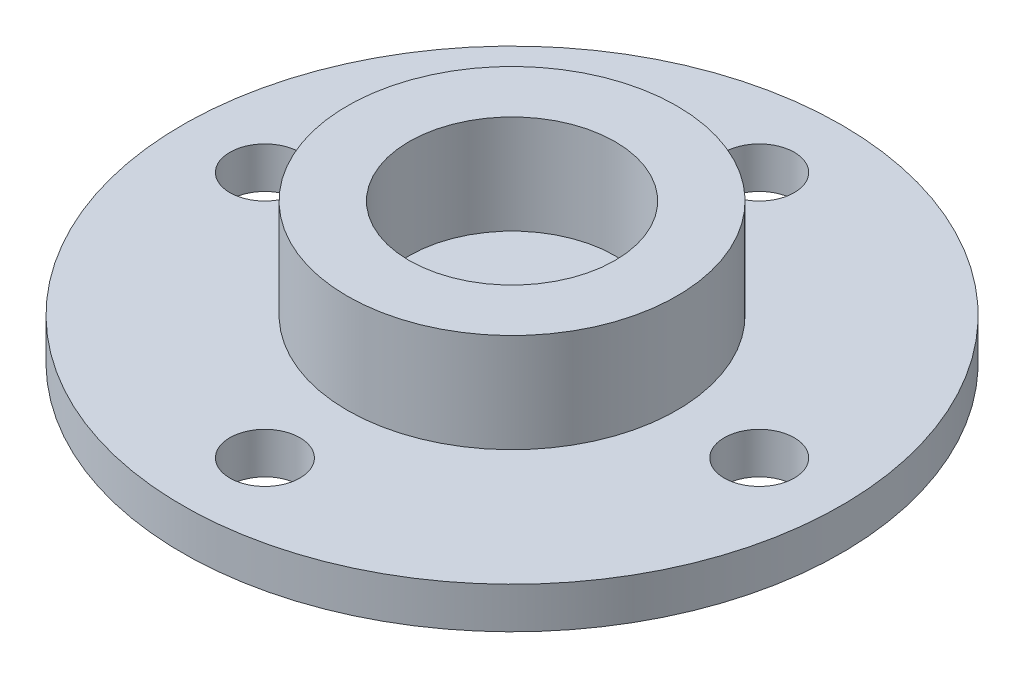
ISO-10303-21;
HEADER;
FILE_DESCRIPTION(('STEP AP214'),'2;1');
FILE_NAME('part.step','',(''),(''),'','','');
FILE_SCHEMA(('AUTOMOTIVE_DESIGN { 1 0 10303 214 1 1 1 1 }'));
ENDSEC;
DATA;
#1=APPLICATION_CONTEXT('core data for automotive mechanical design processes');
#2=APPLICATION_PROTOCOL_DEFINITION('international standard','automotive_design',2000,#1);
#3=PRODUCT_CONTEXT('',#1,'mechanical');
#4=PRODUCT('Part','Part','',(#3));
#5=PRODUCT_RELATED_PRODUCT_CATEGORY('part','',(#4));
#6=PRODUCT_DEFINITION_FORMATION('','',#4);
#7=PRODUCT_DEFINITION_CONTEXT('part definition',#1,'design');
#8=PRODUCT_DEFINITION('design','',#6,#7);
#9=PRODUCT_DEFINITION_SHAPE('','',#8);
#10=(LENGTH_UNIT() NAMED_UNIT(*) SI_UNIT(.MILLI.,.METRE.));
#11=(NAMED_UNIT(*) PLANE_ANGLE_UNIT() SI_UNIT($,.RADIAN.));
#12=(NAMED_UNIT(*) SI_UNIT($,.STERADIAN.) SOLID_ANGLE_UNIT());
#13=UNCERTAINTY_MEASURE_WITH_UNIT(LENGTH_MEASURE(1.E-05),#10,'distance_accuracy_value','');
#14=(GEOMETRIC_REPRESENTATION_CONTEXT(3) GLOBAL_UNCERTAINTY_ASSIGNED_CONTEXT((#13)) GLOBAL_UNIT_ASSIGNED_CONTEXT((#10,
#11,#12)) REPRESENTATION_CONTEXT('',''));
#15=CARTESIAN_POINT('',(0.,0.,0.));
#16=DIRECTION('',(0.,0.,1.));
#17=DIRECTION('',(1.,0.,0.));
#18=AXIS2_PLACEMENT_3D('',#15,#16,#17);
#19=CARTESIAN_POINT('',(0.,0.,0.));
#20=DIRECTION('',(0.,-1.,0.));
#21=DIRECTION('',(0.,0.,-1.));
#22=AXIS2_PLACEMENT_3D('',#19,#20,#21);
#23=CYLINDRICAL_SURFACE('',#22,4.5);
#24=CARTESIAN_POINT('',(0.,0.,0.));
#25=DIRECTION('',(0.,-1.,0.));
#26=DIRECTION('',(0.,0.,-1.));
#27=AXIS2_PLACEMENT_3D('',#24,#25,#26);
#28=CIRCLE('',#27,4.5);
#29=CARTESIAN_POINT('',(0.,0.,-4.5));
#30=VERTEX_POINT('',#29);
#31=EDGE_CURVE('E59',#30,#30,#28,.T.);
#32=ORIENTED_EDGE('',*,*,#31,.T.);
#33=EDGE_LOOP('',(#32));
#34=FACE_BOUND('',#33,.T.);
#35=CARTESIAN_POINT('',(0.,5.,0.));
#36=DIRECTION('',(0.,-1.,0.));
#37=DIRECTION('',(0.,0.,-1.));
#38=AXIS2_PLACEMENT_3D('',#35,#36,#37);
#39=CIRCLE('',#38,4.5);
#40=CARTESIAN_POINT('',(0.,5.,-4.5));
#41=VERTEX_POINT('',#40);
#42=EDGE_CURVE('E10',#41,#41,#39,.T.);
#43=ORIENTED_EDGE('',*,*,#42,.F.);
#44=EDGE_LOOP('',(#43));
#45=FACE_BOUND('',#44,.T.);
#46=ADVANCED_FACE('F31',(#34,#45),#23,.F.);
#47=CARTESIAN_POINT('',(4.5,5.,0.));
#48=DIRECTION('',(0.,1.,0.));
#49=DIRECTION('',(0.,0.,1.));
#50=AXIS2_PLACEMENT_3D('',#47,#48,#49);
#51=PLANE('',#50);
#52=ORIENTED_EDGE('',*,*,#42,.T.);
#53=EDGE_LOOP('',(#52));
#54=FACE_BOUND('',#53,.T.);
#55=CARTESIAN_POINT('',(0.,5.,0.));
#56=DIRECTION('',(0.,-1.,0.));
#57=DIRECTION('',(0.,0.,-1.));
#58=AXIS2_PLACEMENT_3D('',#55,#56,#57);
#59=CIRCLE('',#58,12.5);
#60=CARTESIAN_POINT('',(0.,5.,-12.5));
#61=VERTEX_POINT('',#60);
#62=EDGE_CURVE('E37',#61,#61,#59,.T.);
#63=ORIENTED_EDGE('',*,*,#62,.F.);
#64=EDGE_LOOP('',(#63));
#65=FACE_BOUND('',#64,.T.);
#66=ADVANCED_FACE('F107',(#54,#65),#51,.T.);
#67=CARTESIAN_POINT('',(0.,0.,0.));
#68=DIRECTION('',(0.,-1.,0.));
#69=DIRECTION('',(0.,0.,-1.));
#70=AXIS2_PLACEMENT_3D('',#67,#68,#69);
#71=CYLINDRICAL_SURFACE('',#70,12.5);
#72=ORIENTED_EDGE('',*,*,#62,.T.);
#73=EDGE_LOOP('',(#72));
#74=FACE_BOUND('',#73,.T.);
#75=CARTESIAN_POINT('',(0.,17.,0.));
#76=DIRECTION('',(0.,-1.,0.));
#77=DIRECTION('',(0.,0.,-1.));
#78=AXIS2_PLACEMENT_3D('',#75,#76,#77);
#79=CIRCLE('',#78,12.5);
#80=CARTESIAN_POINT('',(0.,17.,-12.5));
#81=VERTEX_POINT('',#80);
#82=EDGE_CURVE('E41',#81,#81,#79,.T.);
#83=ORIENTED_EDGE('',*,*,#82,.F.);
#84=EDGE_LOOP('',(#83));
#85=FACE_BOUND('',#84,.T.);
#86=ADVANCED_FACE('F111',(#74,#85),#71,.F.);
#87=CARTESIAN_POINT('',(12.5,17.,0.));
#88=DIRECTION('',(0.,1.,0.));
#89=DIRECTION('',(0.,0.,1.));
#90=AXIS2_PLACEMENT_3D('',#87,#88,#89);
#91=PLANE('',#90);
#92=ORIENTED_EDGE('',*,*,#82,.T.);
#93=EDGE_LOOP('',(#92));
#94=FACE_BOUND('',#93,.T.);
#95=CARTESIAN_POINT('',(0.,17.,0.));
#96=DIRECTION('',(0.,-1.,0.));
#97=DIRECTION('',(0.,0.,-1.));
#98=AXIS2_PLACEMENT_3D('',#95,#96,#97);
#99=CIRCLE('',#98,20.);
#100=CARTESIAN_POINT('',(0.,17.,-20.));
#101=VERTEX_POINT('',#100);
#102=EDGE_CURVE('E45',#101,#101,#99,.T.);
#103=ORIENTED_EDGE('',*,*,#102,.F.);
#104=EDGE_LOOP('',(#103));
#105=FACE_BOUND('',#104,.T.);
#106=ADVANCED_FACE('F115',(#94,#105),#91,.T.);
#107=CARTESIAN_POINT('',(0.,0.,0.));
#108=DIRECTION('',(0.,-1.,0.));
#109=DIRECTION('',(0.,0.,-1.));
#110=AXIS2_PLACEMENT_3D('',#107,#108,#109);
#111=CYLINDRICAL_SURFACE('',#110,20.);
#112=ORIENTED_EDGE('',*,*,#102,.T.);
#113=EDGE_LOOP('',(#112));
#114=FACE_BOUND('',#113,.T.);
#115=CARTESIAN_POINT('',(0.,5.,0.));
#116=DIRECTION('',(0.,-1.,0.));
#117=DIRECTION('',(0.,0.,-1.));
#118=AXIS2_PLACEMENT_3D('',#115,#116,#117);
#119=CIRCLE('',#118,20.);
#120=CARTESIAN_POINT('',(0.,5.,-20.));
#121=VERTEX_POINT('',#120);
#122=EDGE_CURVE('E50',#121,#121,#119,.T.);
#123=ORIENTED_EDGE('',*,*,#122,.F.);
#124=EDGE_LOOP('',(#123));
#125=FACE_BOUND('',#124,.T.);
#126=ADVANCED_FACE('F121',(#114,#125),#111,.T.);
#127=CARTESIAN_POINT('',(20.,5.,0.));
#128=DIRECTION('',(0.,1.,0.));
#129=DIRECTION('',(0.,0.,1.));
#130=AXIS2_PLACEMENT_3D('',#127,#128,#129);
#131=PLANE('',#130);
#132=CARTESIAN_POINT('',(0.,5.,30.));
#133=DIRECTION('',(0.,1.,0.));
#134=DIRECTION('',(0.,0.,1.));
#135=AXIS2_PLACEMENT_3D('',#132,#133,#134);
#136=CIRCLE('',#135,4.25);
#137=CARTESIAN_POINT('',(0.,5.,34.25));
#138=VERTEX_POINT('',#137);
#139=EDGE_CURVE('E62',#138,#138,#136,.T.);
#140=ORIENTED_EDGE('',*,*,#139,.F.);
#141=EDGE_LOOP('',(#140));
#142=FACE_BOUND('',#141,.T.);
#143=CARTESIAN_POINT('',(30.,5.,0.));
#144=DIRECTION('',(0.,1.,0.));
#145=DIRECTION('',(0.,0.,1.));
#146=AXIS2_PLACEMENT_3D('',#143,#144,#145);
#147=CIRCLE('',#146,4.25000000000001);
#148=CARTESIAN_POINT('',(30.,5.,4.25000000000001));
#149=VERTEX_POINT('',#148);
#150=EDGE_CURVE('E65',#149,#149,#147,.T.);
#151=ORIENTED_EDGE('',*,*,#150,.F.);
#152=EDGE_LOOP('',(#151));
#153=FACE_BOUND('',#152,.T.);
#154=CARTESIAN_POINT('',(0.,5.,-30.));
#155=DIRECTION('',(0.,1.,0.));
#156=DIRECTION('',(0.,0.,1.));
#157=AXIS2_PLACEMENT_3D('',#154,#155,#156);
#158=CIRCLE('',#157,4.25);
#159=CARTESIAN_POINT('',(0.,5.,-25.75));
#160=VERTEX_POINT('',#159);
#161=EDGE_CURVE('E68',#160,#160,#158,.T.);
#162=ORIENTED_EDGE('',*,*,#161,.F.);
#163=EDGE_LOOP('',(#162));
#164=FACE_BOUND('',#163,.T.);
#165=CARTESIAN_POINT('',(-30.,5.,0.));
#166=DIRECTION('',(0.,1.,0.));
#167=DIRECTION('',(0.,0.,1.));
#168=AXIS2_PLACEMENT_3D('',#165,#166,#167);
#169=CIRCLE('',#168,4.25);
#170=CARTESIAN_POINT('',(-30.,5.,4.24999999999999));
#171=VERTEX_POINT('',#170);
#172=EDGE_CURVE('E71',#171,#171,#169,.T.);
#173=ORIENTED_EDGE('',*,*,#172,.F.);
#174=EDGE_LOOP('',(#173));
#175=FACE_BOUND('',#174,.T.);
#176=ORIENTED_EDGE('',*,*,#122,.T.);
#177=EDGE_LOOP('',(#176));
#178=FACE_BOUND('',#177,.T.);
#179=CARTESIAN_POINT('',(0.,5.,0.));
#180=DIRECTION('',(0.,-1.,0.));
#181=DIRECTION('',(0.,0.,-1.));
#182=AXIS2_PLACEMENT_3D('',#179,#180,#181);
#183=CIRCLE('',#182,40.);
#184=CARTESIAN_POINT('',(0.,5.,-40.));
#185=VERTEX_POINT('',#184);
#186=EDGE_CURVE('E53',#185,#185,#183,.T.);
#187=ORIENTED_EDGE('',*,*,#186,.F.);
#188=EDGE_LOOP('',(#187));
#189=FACE_BOUND('',#188,.T.);
#190=ADVANCED_FACE('F125',(#142,#153,#164,#175,#178,#189),#131,.T.);
#191=CARTESIAN_POINT('',(0.,0.,0.));
#192=DIRECTION('',(0.,-1.,0.));
#193=DIRECTION('',(0.,0.,-1.));
#194=AXIS2_PLACEMENT_3D('',#191,#192,#193);
#195=CYLINDRICAL_SURFACE('',#194,40.);
#196=ORIENTED_EDGE('',*,*,#186,.T.);
#197=EDGE_LOOP('',(#196));
#198=FACE_BOUND('',#197,.T.);
#199=CARTESIAN_POINT('',(0.,0.,0.));
#200=DIRECTION('',(0.,-1.,0.));
#201=DIRECTION('',(0.,0.,-1.));
#202=AXIS2_PLACEMENT_3D('',#199,#200,#201);
#203=CIRCLE('',#202,40.);
#204=CARTESIAN_POINT('',(0.,0.,-40.));
#205=VERTEX_POINT('',#204);
#206=EDGE_CURVE('E56',#205,#205,#203,.T.);
#207=ORIENTED_EDGE('',*,*,#206,.F.);
#208=EDGE_LOOP('',(#207));
#209=FACE_BOUND('',#208,.T.);
#210=ADVANCED_FACE('F93',(#198,#209),#195,.T.);
#211=CARTESIAN_POINT('',(40.,0.,0.));
#212=DIRECTION('',(0.,-1.,0.));
#213=DIRECTION('',(0.,0.,-1.));
#214=AXIS2_PLACEMENT_3D('',#211,#212,#213);
#215=PLANE('',#214);
#216=CARTESIAN_POINT('',(0.,0.,30.));
#217=DIRECTION('',(0.,-1.,0.));
#218=DIRECTION('',(0.,0.,-1.));
#219=AXIS2_PLACEMENT_3D('',#216,#217,#218);
#220=CIRCLE('',#219,4.25);
#221=CARTESIAN_POINT('',(0.,0.,25.75));
#222=VERTEX_POINT('',#221);
#223=EDGE_CURVE('E74',#222,#222,#220,.T.);
#224=ORIENTED_EDGE('',*,*,#223,.F.);
#225=EDGE_LOOP('',(#224));
#226=FACE_BOUND('',#225,.T.);
#227=CARTESIAN_POINT('',(30.,0.,0.));
#228=DIRECTION('',(0.,-1.,0.));
#229=DIRECTION('',(0.,0.,-1.));
#230=AXIS2_PLACEMENT_3D('',#227,#228,#229);
#231=CIRCLE('',#230,4.25000000000001);
#232=CARTESIAN_POINT('',(30.,0.,-4.25000000000001));
#233=VERTEX_POINT('',#232);
#234=EDGE_CURVE('E81',#233,#233,#231,.T.);
#235=ORIENTED_EDGE('',*,*,#234,.F.);
#236=EDGE_LOOP('',(#235));
#237=FACE_BOUND('',#236,.T.);
#238=CARTESIAN_POINT('',(0.,0.,-30.));
#239=DIRECTION('',(0.,-1.,0.));
#240=DIRECTION('',(0.,0.,-1.));
#241=AXIS2_PLACEMENT_3D('',#238,#239,#240);
#242=CIRCLE('',#241,4.25);
#243=CARTESIAN_POINT('',(0.,0.,-34.25));
#244=VERTEX_POINT('',#243);
#245=EDGE_CURVE('E78',#244,#244,#242,.T.);
#246=ORIENTED_EDGE('',*,*,#245,.F.);
#247=EDGE_LOOP('',(#246));
#248=FACE_BOUND('',#247,.T.);
#249=CARTESIAN_POINT('',(-30.,0.,0.));
#250=DIRECTION('',(0.,-1.,0.));
#251=DIRECTION('',(0.,0.,-1.));
#252=AXIS2_PLACEMENT_3D('',#249,#250,#251);
#253=CIRCLE('',#252,4.25);
#254=CARTESIAN_POINT('',(-30.,0.,-4.25));
#255=VERTEX_POINT('',#254);
#256=EDGE_CURVE('E75',#255,#255,#253,.T.);
#257=ORIENTED_EDGE('',*,*,#256,.F.);
#258=EDGE_LOOP('',(#257));
#259=FACE_BOUND('',#258,.T.);
#260=ORIENTED_EDGE('',*,*,#206,.T.);
#261=EDGE_LOOP('',(#260));
#262=FACE_BOUND('',#261,.T.);
#263=ORIENTED_EDGE('',*,*,#31,.F.);
#264=EDGE_LOOP('',(#263));
#265=FACE_BOUND('',#264,.T.);
#266=ADVANCED_FACE('F89',(#226,#237,#248,#259,#262,#265),#215,.T.);
#267=CARTESIAN_POINT('',(-30.,10.,0.));
#268=DIRECTION('',(0.,-1.,0.));
#269=DIRECTION('',(0.,0.,-1.));
#270=AXIS2_PLACEMENT_3D('',#267,#268,#269);
#271=CYLINDRICAL_SURFACE('',#270,4.25);
#272=ORIENTED_EDGE('',*,*,#172,.T.);
#273=EDGE_LOOP('',(#272));
#274=FACE_BOUND('',#273,.T.);
#275=ORIENTED_EDGE('',*,*,#256,.T.);
#276=EDGE_LOOP('',(#275));
#277=FACE_BOUND('',#276,.T.);
#278=ADVANCED_FACE('F92',(#274,#277),#271,.F.);
#279=CARTESIAN_POINT('',(0.,10.,-30.));
#280=DIRECTION('',(0.,-1.,0.));
#281=DIRECTION('',(0.,0.,-1.));
#282=AXIS2_PLACEMENT_3D('',#279,#280,#281);
#283=CYLINDRICAL_SURFACE('',#282,4.25);
#284=ORIENTED_EDGE('',*,*,#161,.T.);
#285=EDGE_LOOP('',(#284));
#286=FACE_BOUND('',#285,.T.);
#287=ORIENTED_EDGE('',*,*,#245,.T.);
#288=EDGE_LOOP('',(#287));
#289=FACE_BOUND('',#288,.T.);
#290=ADVANCED_FACE('F135',(#286,#289),#283,.F.);
#291=CARTESIAN_POINT('',(30.,10.,0.));
#292=DIRECTION('',(0.,-1.,0.));
#293=DIRECTION('',(0.,0.,-1.));
#294=AXIS2_PLACEMENT_3D('',#291,#292,#293);
#295=CYLINDRICAL_SURFACE('',#294,4.25000000000001);
#296=ORIENTED_EDGE('',*,*,#150,.T.);
#297=EDGE_LOOP('',(#296));
#298=FACE_BOUND('',#297,.T.);
#299=ORIENTED_EDGE('',*,*,#234,.T.);
#300=EDGE_LOOP('',(#299));
#301=FACE_BOUND('',#300,.T.);
#302=ADVANCED_FACE('F139',(#298,#301),#295,.F.);
#303=CARTESIAN_POINT('',(0.,10.,30.));
#304=DIRECTION('',(0.,-1.,0.));
#305=DIRECTION('',(0.,0.,-1.));
#306=AXIS2_PLACEMENT_3D('',#303,#304,#305);
#307=CYLINDRICAL_SURFACE('',#306,4.25);
#308=ORIENTED_EDGE('',*,*,#139,.T.);
#309=EDGE_LOOP('',(#308));
#310=FACE_BOUND('',#309,.T.);
#311=ORIENTED_EDGE('',*,*,#223,.T.);
#312=EDGE_LOOP('',(#311));
#313=FACE_BOUND('',#312,.T.);
#314=ADVANCED_FACE('F87',(#310,#313),#307,.F.);
#315=CLOSED_SHELL('',(#46,#66,#86,#106,#126,#190,#210,#266,#278,#290,#302,#314));
#316=MANIFOLD_SOLID_BREP('B2',#315);
#317=ADVANCED_BREP_SHAPE_REPRESENTATION('',(#18,#316),#14);
#318=SHAPE_DEFINITION_REPRESENTATION(#9,#317);
ENDSEC;
END-ISO-10303-21;
